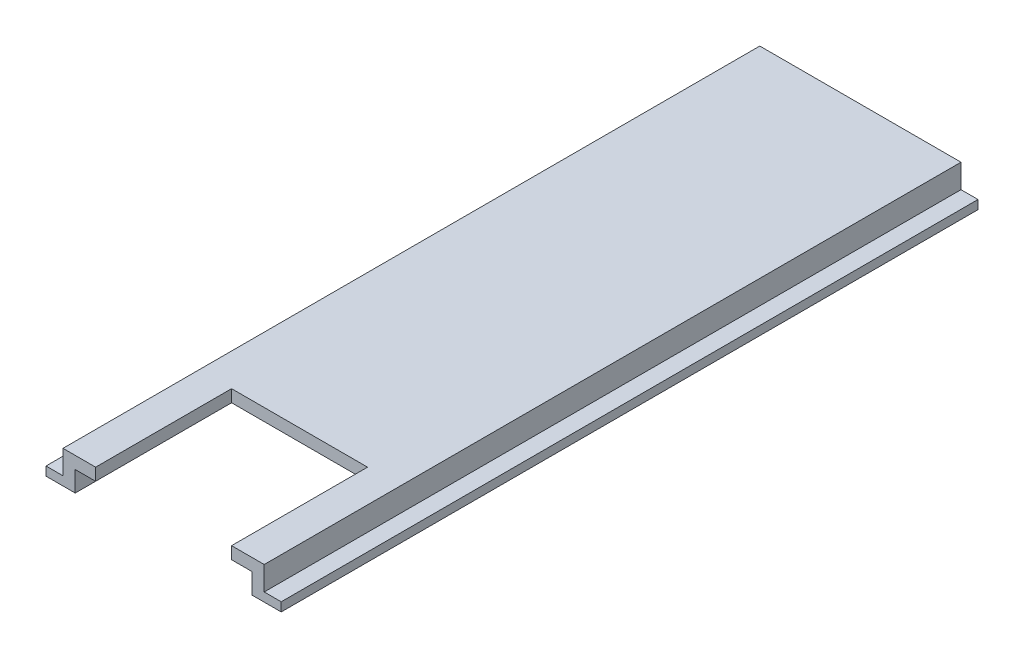
ISO-10303-21;
HEADER;
FILE_DESCRIPTION(('STEP AP214'),'2;1');
FILE_NAME('part.step','',(''),(''),'','','');
FILE_SCHEMA(('AUTOMOTIVE_DESIGN { 1 0 10303 214 1 1 1 1 }'));
ENDSEC;
DATA;
#1=APPLICATION_CONTEXT('core data for automotive mechanical design processes');
#2=APPLICATION_PROTOCOL_DEFINITION('international standard','automotive_design',2000,#1);
#3=PRODUCT_CONTEXT('',#1,'mechanical');
#4=PRODUCT('Part','Part','',(#3));
#5=PRODUCT_RELATED_PRODUCT_CATEGORY('part','',(#4));
#6=PRODUCT_DEFINITION_FORMATION('','',#4);
#7=PRODUCT_DEFINITION_CONTEXT('part definition',#1,'design');
#8=PRODUCT_DEFINITION('design','',#6,#7);
#9=PRODUCT_DEFINITION_SHAPE('','',#8);
#10=(LENGTH_UNIT() NAMED_UNIT(*) SI_UNIT(.MILLI.,.METRE.));
#11=(NAMED_UNIT(*) PLANE_ANGLE_UNIT() SI_UNIT($,.RADIAN.));
#12=(NAMED_UNIT(*) SI_UNIT($,.STERADIAN.) SOLID_ANGLE_UNIT());
#13=UNCERTAINTY_MEASURE_WITH_UNIT(LENGTH_MEASURE(1.E-05),#10,'distance_accuracy_value','');
#14=(GEOMETRIC_REPRESENTATION_CONTEXT(3) GLOBAL_UNCERTAINTY_ASSIGNED_CONTEXT((#13)) GLOBAL_UNIT_ASSIGNED_CONTEXT((#10,
#11,#12)) REPRESENTATION_CONTEXT('',''));
#15=CARTESIAN_POINT('',(0.,0.,0.));
#16=DIRECTION('',(0.,0.,1.));
#17=DIRECTION('',(1.,0.,0.));
#18=AXIS2_PLACEMENT_3D('',#15,#16,#17);
#19=CARTESIAN_POINT('',(0.,0.,56.5));
#20=DIRECTION('',(0.,0.,-1.));
#21=DIRECTION('',(-1.,0.,0.));
#22=AXIS2_PLACEMENT_3D('',#19,#20,#21);
#23=PLANE('',#22);
#24=DIRECTION('',(0.,1.,0.));
#25=VECTOR('',#24,1.);
#26=CARTESIAN_POINT('',(-9.,-0.00100000000000534,56.5));
#27=LINE('',#26,#25);
#28=CARTESIAN_POINT('',(-9.,2.99999999999999,56.5));
#29=VERTEX_POINT('',#28);
#30=CARTESIAN_POINT('',(-9.,4.79999999999999,56.5));
#31=VERTEX_POINT('',#30);
#32=EDGE_CURVE('E251',#29,#31,#27,.T.);
#33=ORIENTED_EDGE('',*,*,#32,.T.);
#34=DIRECTION('',(1.,0.,0.));
#35=VECTOR('',#34,1.);
#36=CARTESIAN_POINT('',(-13.8,4.79999999999999,56.5));
#37=LINE('',#36,#35);
#38=CARTESIAN_POINT('',(-13.8,4.79999999999999,56.5));
#39=VERTEX_POINT('',#38);
#40=EDGE_CURVE('E219',#39,#31,#37,.T.);
#41=ORIENTED_EDGE('',*,*,#40,.F.);
#42=DIRECTION('',(0.,1.,0.));
#43=VECTOR('',#42,1.);
#44=CARTESIAN_POINT('',(-13.8,1.29999999999999,56.5));
#45=LINE('',#44,#43);
#46=CARTESIAN_POINT('',(-13.8,1.29999999999999,56.5));
#47=VERTEX_POINT('',#46);
#48=EDGE_CURVE('E215',#47,#39,#45,.T.);
#49=ORIENTED_EDGE('',*,*,#48,.F.);
#50=DIRECTION('',(1.,0.,0.));
#51=VECTOR('',#50,1.);
#52=CARTESIAN_POINT('',(-16.3,1.29999999999999,56.5));
#53=LINE('',#52,#51);
#54=CARTESIAN_POINT('',(-16.3,1.29999999999999,56.5));
#55=VERTEX_POINT('',#54);
#56=EDGE_CURVE('E212',#55,#47,#53,.T.);
#57=ORIENTED_EDGE('',*,*,#56,.F.);
#58=DIRECTION('',(0.,1.,0.));
#59=VECTOR('',#58,1.);
#60=CARTESIAN_POINT('',(-16.3,0.,56.5));
#61=LINE('',#60,#59);
#62=CARTESIAN_POINT('',(-16.3,0.,56.5));
#63=VERTEX_POINT('',#62);
#64=EDGE_CURVE('E209',#63,#55,#61,.T.);
#65=ORIENTED_EDGE('',*,*,#64,.F.);
#66=DIRECTION('',(1.,0.,0.));
#67=VECTOR('',#66,1.);
#68=CARTESIAN_POINT('',(-12.,0.,56.5));
#69=LINE('',#68,#67);
#70=CARTESIAN_POINT('',(-12.,0.,56.5));
#71=VERTEX_POINT('',#70);
#72=EDGE_CURVE('E255',#63,#71,#69,.T.);
#73=ORIENTED_EDGE('',*,*,#72,.T.);
#74=DIRECTION('',(0.,1.,0.));
#75=VECTOR('',#74,1.);
#76=CARTESIAN_POINT('',(-12.,2.99999999999999,56.5));
#77=LINE('',#76,#75);
#78=CARTESIAN_POINT('',(-12.,2.99999999999999,56.5));
#79=VERTEX_POINT('',#78);
#80=EDGE_CURVE('E264',#71,#79,#77,.T.);
#81=ORIENTED_EDGE('',*,*,#80,.T.);
#82=DIRECTION('',(1.,0.,0.));
#83=VECTOR('',#82,1.);
#84=CARTESIAN_POINT('',(14.,3.,56.5));
#85=LINE('',#84,#83);
#86=EDGE_CURVE('E267',#79,#29,#85,.T.);
#87=ORIENTED_EDGE('',*,*,#86,.T.);
#88=EDGE_LOOP('',(#33,#41,#49,#57,#65,#73,#81,#87));
#89=FACE_BOUND('',#88,.T.);
#90=ADVANCED_FACE('F43',(#89),#23,.F.);
#91=CARTESIAN_POINT('',(-12.,0.,56.5));
#92=DIRECTION('',(0.,1.,0.));
#93=DIRECTION('',(-1.,0.,0.));
#94=AXIS2_PLACEMENT_3D('',#91,#92,#93);
#95=PLANE('',#94);
#96=ORIENTED_EDGE('',*,*,#72,.F.);
#97=DIRECTION('',(0.,0.,1.));
#98=VECTOR('',#97,1.);
#99=CARTESIAN_POINT('',(-16.3,0.,0.));
#100=LINE('',#99,#98);
#101=CARTESIAN_POINT('',(-16.3,0.,-46.));
#102=VERTEX_POINT('',#101);
#103=EDGE_CURVE('E227',#102,#63,#100,.T.);
#104=ORIENTED_EDGE('',*,*,#103,.F.);
#105=DIRECTION('',(-1.,0.,0.));
#106=VECTOR('',#105,1.);
#107=CARTESIAN_POINT('',(0.,0.,-46.));
#108=LINE('',#107,#106);
#109=CARTESIAN_POINT('',(-12.,0.,-46.));
#110=VERTEX_POINT('',#109);
#111=EDGE_CURVE('E194',#110,#102,#108,.T.);
#112=ORIENTED_EDGE('',*,*,#111,.F.);
#113=DIRECTION('',(0.,0.,-1.));
#114=VECTOR('',#113,1.);
#115=CARTESIAN_POINT('',(-12.,0.,56.5));
#116=LINE('',#115,#114);
#117=EDGE_CURVE('E51',#71,#110,#116,.T.);
#118=ORIENTED_EDGE('',*,*,#117,.F.);
#119=EDGE_LOOP('',(#96,#104,#112,#118));
#120=FACE_BOUND('',#119,.T.);
#121=ADVANCED_FACE('F45',(#120),#95,.F.);
#122=CARTESIAN_POINT('',(-12.,2.99999999999999,56.5));
#123=DIRECTION('',(-1.,0.,0.));
#124=DIRECTION('',(0.,-1.,0.));
#125=AXIS2_PLACEMENT_3D('',#122,#123,#124);
#126=PLANE('',#125);
#127=ORIENTED_EDGE('',*,*,#117,.T.);
#128=DIRECTION('',(0.,-1.,0.));
#129=VECTOR('',#128,1.);
#130=CARTESIAN_POINT('',(-12.,0.,-46.));
#131=LINE('',#130,#129);
#132=CARTESIAN_POINT('',(-12.,2.99999999999999,-46.));
#133=VERTEX_POINT('',#132);
#134=EDGE_CURVE('E191',#133,#110,#131,.T.);
#135=ORIENTED_EDGE('',*,*,#134,.F.);
#136=DIRECTION('',(0.,0.,-1.));
#137=VECTOR('',#136,1.);
#138=CARTESIAN_POINT('',(-12.,2.99999999999999,56.5));
#139=LINE('',#138,#137);
#140=EDGE_CURVE('E279',#79,#133,#139,.T.);
#141=ORIENTED_EDGE('',*,*,#140,.F.);
#142=ORIENTED_EDGE('',*,*,#80,.F.);
#143=EDGE_LOOP('',(#127,#135,#141,#142));
#144=FACE_BOUND('',#143,.T.);
#145=ADVANCED_FACE('F284',(#144),#126,.F.);
#146=CARTESIAN_POINT('',(14.,3.,56.5));
#147=DIRECTION('',(0.,1.,0.));
#148=DIRECTION('',(-1.,0.,0.));
#149=AXIS2_PLACEMENT_3D('',#146,#147,#148);
#150=PLANE('',#149);
#151=DIRECTION('',(1.,0.,0.));
#152=VECTOR('',#151,1.);
#153=CARTESIAN_POINT('',(-9.,2.99999999999999,36.5));
#154=LINE('',#153,#152);
#155=CARTESIAN_POINT('',(-9.,2.99999999999999,36.5));
#156=VERTEX_POINT('',#155);
#157=CARTESIAN_POINT('',(11.,2.99999999999999,36.5));
#158=VERTEX_POINT('',#157);
#159=EDGE_CURVE('E245',#156,#158,#154,.T.);
#160=ORIENTED_EDGE('',*,*,#159,.F.);
#161=DIRECTION('',(0.,0.,-1.));
#162=VECTOR('',#161,1.);
#163=CARTESIAN_POINT('',(-9.,2.99999999999999,36.5));
#164=LINE('',#163,#162);
#165=EDGE_CURVE('E248',#29,#156,#164,.T.);
#166=ORIENTED_EDGE('',*,*,#165,.F.);
#167=ORIENTED_EDGE('',*,*,#86,.F.);
#168=ORIENTED_EDGE('',*,*,#140,.T.);
#169=DIRECTION('',(-1.,0.,0.));
#170=VECTOR('',#169,1.);
#171=CARTESIAN_POINT('',(0.,2.99999999999999,-46.));
#172=LINE('',#171,#170);
#173=CARTESIAN_POINT('',(14.,3.,-46.));
#174=VERTEX_POINT('',#173);
#175=EDGE_CURVE('E188',#174,#133,#172,.T.);
#176=ORIENTED_EDGE('',*,*,#175,.F.);
#177=DIRECTION('',(0.,0.,-1.));
#178=VECTOR('',#177,1.);
#179=CARTESIAN_POINT('',(14.,3.,56.5));
#180=LINE('',#179,#178);
#181=CARTESIAN_POINT('',(14.,3.,56.5));
#182=VERTEX_POINT('',#181);
#183=EDGE_CURVE('E277',#182,#174,#180,.T.);
#184=ORIENTED_EDGE('',*,*,#183,.F.);
#185=CARTESIAN_POINT('',(11.,2.99999999999999,56.5));
#186=VERTEX_POINT('',#185);
#187=EDGE_CURVE('E266',#186,#182,#85,.T.);
#188=ORIENTED_EDGE('',*,*,#187,.F.);
#189=DIRECTION('',(0.,0.,1.));
#190=VECTOR('',#189,1.);
#191=CARTESIAN_POINT('',(11.,2.99999999999999,36.5));
#192=LINE('',#191,#190);
#193=EDGE_CURVE('E65',#158,#186,#192,.T.);
#194=ORIENTED_EDGE('',*,*,#193,.F.);
#195=EDGE_LOOP('',(#160,#166,#167,#168,#176,#184,#188,#194));
#196=FACE_BOUND('',#195,.T.);
#197=ADVANCED_FACE('F324',(#196),#150,.F.);
#198=CARTESIAN_POINT('',(14.,0.,56.5));
#199=DIRECTION('',(1.,0.,0.));
#200=DIRECTION('',(0.,0.,-1.));
#201=AXIS2_PLACEMENT_3D('',#198,#199,#200);
#202=PLANE('',#201);
#203=ORIENTED_EDGE('',*,*,#183,.T.);
#204=DIRECTION('',(0.,1.,0.));
#205=VECTOR('',#204,1.);
#206=CARTESIAN_POINT('',(14.,0.,-46.));
#207=LINE('',#206,#205);
#208=CARTESIAN_POINT('',(14.,0.,-46.));
#209=VERTEX_POINT('',#208);
#210=EDGE_CURVE('E185',#209,#174,#207,.T.);
#211=ORIENTED_EDGE('',*,*,#210,.F.);
#212=DIRECTION('',(0.,0.,-1.));
#213=VECTOR('',#212,1.);
#214=CARTESIAN_POINT('',(14.,0.,56.5));
#215=LINE('',#214,#213);
#216=CARTESIAN_POINT('',(14.,0.,56.5));
#217=VERTEX_POINT('',#216);
#218=EDGE_CURVE('E275',#217,#209,#215,.T.);
#219=ORIENTED_EDGE('',*,*,#218,.F.);
#220=DIRECTION('',(0.,-1.,0.));
#221=VECTOR('',#220,1.);
#222=CARTESIAN_POINT('',(14.,0.,56.5));
#223=LINE('',#222,#221);
#224=EDGE_CURVE('E270',#182,#217,#223,.T.);
#225=ORIENTED_EDGE('',*,*,#224,.F.);
#226=EDGE_LOOP('',(#203,#211,#219,#225));
#227=FACE_BOUND('',#226,.T.);
#228=ADVANCED_FACE('F318',(#227),#202,.F.);
#229=CARTESIAN_POINT('',(18.5,0.,56.5));
#230=DIRECTION('',(0.,1.,0.));
#231=DIRECTION('',(-1.,0.,0.));
#232=AXIS2_PLACEMENT_3D('',#229,#230,#231);
#233=PLANE('',#232);
#234=ORIENTED_EDGE('',*,*,#218,.T.);
#235=DIRECTION('',(-1.,0.,0.));
#236=VECTOR('',#235,1.);
#237=CARTESIAN_POINT('',(0.,0.,-46.));
#238=LINE('',#237,#236);
#239=CARTESIAN_POINT('',(18.3,0.,-46.));
#240=VERTEX_POINT('',#239);
#241=EDGE_CURVE('E175',#240,#209,#238,.T.);
#242=ORIENTED_EDGE('',*,*,#241,.F.);
#243=DIRECTION('',(0.,0.,1.));
#244=VECTOR('',#243,1.);
#245=CARTESIAN_POINT('',(18.3,0.,0.));
#246=LINE('',#245,#244);
#247=CARTESIAN_POINT('',(18.3,0.,56.5));
#248=VERTEX_POINT('',#247);
#249=EDGE_CURVE('E165',#240,#248,#246,.T.);
#250=ORIENTED_EDGE('',*,*,#249,.T.);
#251=DIRECTION('',(1.,0.,0.));
#252=VECTOR('',#251,1.);
#253=CARTESIAN_POINT('',(18.5,0.,56.5));
#254=LINE('',#253,#252);
#255=EDGE_CURVE('E272',#217,#248,#254,.T.);
#256=ORIENTED_EDGE('',*,*,#255,.F.);
#257=EDGE_LOOP('',(#234,#242,#250,#256));
#258=FACE_BOUND('',#257,.T.);
#259=ADVANCED_FACE('F314',(#258),#233,.F.);
#260=ORIENTED_EDGE('',*,*,#255,.T.);
#261=DIRECTION('',(0.,-1.,0.));
#262=VECTOR('',#261,1.);
#263=CARTESIAN_POINT('',(18.3,1.3,56.5));
#264=LINE('',#263,#262);
#265=CARTESIAN_POINT('',(18.3,1.3,56.5));
#266=VERTEX_POINT('',#265);
#267=EDGE_CURVE('E225',#266,#248,#264,.T.);
#268=ORIENTED_EDGE('',*,*,#267,.F.);
#269=DIRECTION('',(1.,0.,0.));
#270=VECTOR('',#269,1.);
#271=CARTESIAN_POINT('',(15.8,1.3,56.5));
#272=LINE('',#271,#270);
#273=CARTESIAN_POINT('',(15.8,1.3,56.5));
#274=VERTEX_POINT('',#273);
#275=EDGE_CURVE('E162',#274,#266,#272,.T.);
#276=ORIENTED_EDGE('',*,*,#275,.F.);
#277=DIRECTION('',(0.,-1.,0.));
#278=VECTOR('',#277,1.);
#279=CARTESIAN_POINT('',(15.8,4.79999999999999,56.5));
#280=LINE('',#279,#278);
#281=CARTESIAN_POINT('',(15.8,4.79999999999999,56.5));
#282=VERTEX_POINT('',#281);
#283=EDGE_CURVE('E221',#282,#274,#280,.T.);
#284=ORIENTED_EDGE('',*,*,#283,.F.);
#285=CARTESIAN_POINT('',(11.,4.79999999999999,56.5));
#286=VERTEX_POINT('',#285);
#287=EDGE_CURVE('E218',#286,#282,#37,.T.);
#288=ORIENTED_EDGE('',*,*,#287,.F.);
#289=DIRECTION('',(0.,1.,0.));
#290=VECTOR('',#289,1.);
#291=CARTESIAN_POINT('',(11.,-0.00100000000000534,56.5));
#292=LINE('',#291,#290);
#293=EDGE_CURVE('E259',#186,#286,#292,.T.);
#294=ORIENTED_EDGE('',*,*,#293,.F.);
#295=ORIENTED_EDGE('',*,*,#187,.T.);
#296=ORIENTED_EDGE('',*,*,#224,.T.);
#297=EDGE_LOOP('',(#260,#268,#276,#284,#288,#294,#295,#296));
#298=FACE_BOUND('',#297,.T.);
#299=ADVANCED_FACE('F311',(#298),#23,.F.);
#300=CARTESIAN_POINT('',(-9.,-0.00100000000000534,36.5));
#301=DIRECTION('',(-1.,0.,0.));
#302=DIRECTION('',(0.,0.,1.));
#303=AXIS2_PLACEMENT_3D('',#300,#301,#302);
#304=PLANE('',#303);
#305=DIRECTION('',(0.,1.,0.));
#306=VECTOR('',#305,1.);
#307=CARTESIAN_POINT('',(-9.,-0.00100000000000534,36.5));
#308=LINE('',#307,#306);
#309=CARTESIAN_POINT('',(-9.,4.79999999999999,36.5));
#310=VERTEX_POINT('',#309);
#311=EDGE_CURVE('E252',#156,#310,#308,.T.);
#312=ORIENTED_EDGE('',*,*,#311,.T.);
#313=DIRECTION('',(0.,0.,1.));
#314=VECTOR('',#313,1.);
#315=CARTESIAN_POINT('',(-9.,4.79999999999999,36.5));
#316=LINE('',#315,#314);
#317=EDGE_CURVE('E241',#310,#31,#316,.T.);
#318=ORIENTED_EDGE('',*,*,#317,.T.);
#319=ORIENTED_EDGE('',*,*,#32,.F.);
#320=ORIENTED_EDGE('',*,*,#165,.T.);
#321=EDGE_LOOP('',(#312,#318,#319,#320));
#322=FACE_BOUND('',#321,.T.);
#323=ADVANCED_FACE('F328',(#322),#304,.F.);
#324=CARTESIAN_POINT('',(-9.,-0.00100000000000534,36.5));
#325=DIRECTION('',(0.,0.,-1.));
#326=DIRECTION('',(-1.,0.,0.));
#327=AXIS2_PLACEMENT_3D('',#324,#325,#326);
#328=PLANE('',#327);
#329=DIRECTION('',(0.,1.,0.));
#330=VECTOR('',#329,1.);
#331=CARTESIAN_POINT('',(11.,-0.00100000000000534,36.5));
#332=LINE('',#331,#330);
#333=CARTESIAN_POINT('',(11.,4.79999999999999,36.5));
#334=VERTEX_POINT('',#333);
#335=EDGE_CURVE('E256',#158,#334,#332,.T.);
#336=ORIENTED_EDGE('',*,*,#335,.T.);
#337=DIRECTION('',(-1.,0.,0.));
#338=VECTOR('',#337,1.);
#339=CARTESIAN_POINT('',(-9.,4.79999999999999,36.5));
#340=LINE('',#339,#338);
#341=EDGE_CURVE('E58',#334,#310,#340,.T.);
#342=ORIENTED_EDGE('',*,*,#341,.T.);
#343=ORIENTED_EDGE('',*,*,#311,.F.);
#344=ORIENTED_EDGE('',*,*,#159,.T.);
#345=EDGE_LOOP('',(#336,#342,#343,#344));
#346=FACE_BOUND('',#345,.T.);
#347=ADVANCED_FACE('F330',(#346),#328,.F.);
#348=CARTESIAN_POINT('',(11.,-0.00100000000000534,36.5));
#349=DIRECTION('',(1.,0.,0.));
#350=DIRECTION('',(0.,0.,-1.));
#351=AXIS2_PLACEMENT_3D('',#348,#349,#350);
#352=PLANE('',#351);
#353=ORIENTED_EDGE('',*,*,#293,.T.);
#354=DIRECTION('',(0.,0.,-1.));
#355=VECTOR('',#354,1.);
#356=CARTESIAN_POINT('',(11.,4.79999999999999,36.5));
#357=LINE('',#356,#355);
#358=EDGE_CURVE('E11',#286,#334,#357,.T.);
#359=ORIENTED_EDGE('',*,*,#358,.T.);
#360=ORIENTED_EDGE('',*,*,#335,.F.);
#361=ORIENTED_EDGE('',*,*,#193,.T.);
#362=EDGE_LOOP('',(#353,#359,#360,#361));
#363=FACE_BOUND('',#362,.T.);
#364=ADVANCED_FACE('F331',(#363),#352,.F.);
#365=CARTESIAN_POINT('',(-13.8,4.79999999999999,0.));
#366=DIRECTION('',(0.,-1.,0.));
#367=DIRECTION('',(0.,0.,-1.));
#368=AXIS2_PLACEMENT_3D('',#365,#366,#367);
#369=PLANE('',#368);
#370=ORIENTED_EDGE('',*,*,#341,.F.);
#371=ORIENTED_EDGE('',*,*,#358,.F.);
#372=ORIENTED_EDGE('',*,*,#287,.T.);
#373=DIRECTION('',(0.,0.,1.));
#374=VECTOR('',#373,1.);
#375=CARTESIAN_POINT('',(15.8,4.79999999999999,0.));
#376=LINE('',#375,#374);
#377=CARTESIAN_POINT('',(15.8,4.79999999999999,-46.));
#378=VERTEX_POINT('',#377);
#379=EDGE_CURVE('E230',#378,#282,#376,.T.);
#380=ORIENTED_EDGE('',*,*,#379,.F.);
#381=DIRECTION('',(1.,0.,0.));
#382=VECTOR('',#381,1.);
#383=CARTESIAN_POINT('',(0.,4.79999999999999,-46.));
#384=LINE('',#383,#382);
#385=CARTESIAN_POINT('',(-13.8,4.79999999999999,-46.));
#386=VERTEX_POINT('',#385);
#387=EDGE_CURVE('E206',#386,#378,#384,.T.);
#388=ORIENTED_EDGE('',*,*,#387,.F.);
#389=DIRECTION('',(0.,0.,1.));
#390=VECTOR('',#389,1.);
#391=CARTESIAN_POINT('',(-13.8,4.79999999999999,0.));
#392=LINE('',#391,#390);
#393=EDGE_CURVE('E233',#386,#39,#392,.T.);
#394=ORIENTED_EDGE('',*,*,#393,.T.);
#395=ORIENTED_EDGE('',*,*,#40,.T.);
#396=ORIENTED_EDGE('',*,*,#317,.F.);
#397=EDGE_LOOP('',(#370,#371,#372,#380,#388,#394,#395,#396));
#398=FACE_BOUND('',#397,.T.);
#399=ADVANCED_FACE('F305',(#398),#369,.F.);
#400=CARTESIAN_POINT('',(18.3,1.3,0.));
#401=DIRECTION('',(-1.,0.,0.));
#402=DIRECTION('',(0.,0.,1.));
#403=AXIS2_PLACEMENT_3D('',#400,#401,#402);
#404=PLANE('',#403);
#405=ORIENTED_EDGE('',*,*,#267,.T.);
#406=ORIENTED_EDGE('',*,*,#249,.F.);
#407=DIRECTION('',(0.,-1.,0.));
#408=VECTOR('',#407,1.);
#409=CARTESIAN_POINT('',(18.3,0.,-46.));
#410=LINE('',#409,#408);
#411=CARTESIAN_POINT('',(18.3,1.3,-46.));
#412=VERTEX_POINT('',#411);
#413=EDGE_CURVE('E169',#412,#240,#410,.T.);
#414=ORIENTED_EDGE('',*,*,#413,.F.);
#415=DIRECTION('',(0.,0.,1.));
#416=VECTOR('',#415,1.);
#417=CARTESIAN_POINT('',(18.3,1.3,0.));
#418=LINE('',#417,#416);
#419=EDGE_CURVE('E156',#412,#266,#418,.T.);
#420=ORIENTED_EDGE('',*,*,#419,.T.);
#421=EDGE_LOOP('',(#405,#406,#414,#420));
#422=FACE_BOUND('',#421,.T.);
#423=ADVANCED_FACE('F170',(#422),#404,.F.);
#424=CARTESIAN_POINT('',(15.8,1.3,0.));
#425=DIRECTION('',(0.,-1.,0.));
#426=DIRECTION('',(0.,0.,-1.));
#427=AXIS2_PLACEMENT_3D('',#424,#425,#426);
#428=PLANE('',#427);
#429=ORIENTED_EDGE('',*,*,#275,.T.);
#430=ORIENTED_EDGE('',*,*,#419,.F.);
#431=DIRECTION('',(1.,0.,0.));
#432=VECTOR('',#431,1.);
#433=CARTESIAN_POINT('',(0.,1.3,-46.));
#434=LINE('',#433,#432);
#435=CARTESIAN_POINT('',(15.8,1.3,-46.));
#436=VERTEX_POINT('',#435);
#437=EDGE_CURVE('E160',#436,#412,#434,.T.);
#438=ORIENTED_EDGE('',*,*,#437,.F.);
#439=DIRECTION('',(0.,0.,1.));
#440=VECTOR('',#439,1.);
#441=CARTESIAN_POINT('',(15.8,1.3,0.));
#442=LINE('',#441,#440);
#443=EDGE_CURVE('E166',#436,#274,#442,.T.);
#444=ORIENTED_EDGE('',*,*,#443,.T.);
#445=EDGE_LOOP('',(#429,#430,#438,#444));
#446=FACE_BOUND('',#445,.T.);
#447=ADVANCED_FACE('F158',(#446),#428,.F.);
#448=CARTESIAN_POINT('',(15.8,4.79999999999999,0.));
#449=DIRECTION('',(-1.,0.,0.));
#450=DIRECTION('',(0.,0.,1.));
#451=AXIS2_PLACEMENT_3D('',#448,#449,#450);
#452=PLANE('',#451);
#453=ORIENTED_EDGE('',*,*,#283,.T.);
#454=ORIENTED_EDGE('',*,*,#443,.F.);
#455=DIRECTION('',(0.,-1.,0.));
#456=VECTOR('',#455,1.);
#457=CARTESIAN_POINT('',(15.8,0.,-46.));
#458=LINE('',#457,#456);
#459=EDGE_CURVE('E181',#378,#436,#458,.T.);
#460=ORIENTED_EDGE('',*,*,#459,.F.);
#461=ORIENTED_EDGE('',*,*,#379,.T.);
#462=EDGE_LOOP('',(#453,#454,#460,#461));
#463=FACE_BOUND('',#462,.T.);
#464=ADVANCED_FACE('F307',(#463),#452,.F.);
#465=CARTESIAN_POINT('',(-13.8,1.29999999999999,0.));
#466=DIRECTION('',(1.,0.,0.));
#467=DIRECTION('',(0.,0.,-1.));
#468=AXIS2_PLACEMENT_3D('',#465,#466,#467);
#469=PLANE('',#468);
#470=ORIENTED_EDGE('',*,*,#48,.T.);
#471=ORIENTED_EDGE('',*,*,#393,.F.);
#472=DIRECTION('',(0.,1.,0.));
#473=VECTOR('',#472,1.);
#474=CARTESIAN_POINT('',(-13.8,0.,-46.));
#475=LINE('',#474,#473);
#476=CARTESIAN_POINT('',(-13.8,1.29999999999999,-46.));
#477=VERTEX_POINT('',#476);
#478=EDGE_CURVE('E203',#477,#386,#475,.T.);
#479=ORIENTED_EDGE('',*,*,#478,.F.);
#480=DIRECTION('',(0.,0.,1.));
#481=VECTOR('',#480,1.);
#482=CARTESIAN_POINT('',(-13.8,1.29999999999999,0.));
#483=LINE('',#482,#481);
#484=EDGE_CURVE('E235',#477,#47,#483,.T.);
#485=ORIENTED_EDGE('',*,*,#484,.T.);
#486=EDGE_LOOP('',(#470,#471,#479,#485));
#487=FACE_BOUND('',#486,.T.);
#488=ADVANCED_FACE('F304',(#487),#469,.F.);
#489=CARTESIAN_POINT('',(-16.3,1.29999999999999,0.));
#490=DIRECTION('',(0.,-1.,0.));
#491=DIRECTION('',(0.,0.,-1.));
#492=AXIS2_PLACEMENT_3D('',#489,#490,#491);
#493=PLANE('',#492);
#494=ORIENTED_EDGE('',*,*,#56,.T.);
#495=ORIENTED_EDGE('',*,*,#484,.F.);
#496=DIRECTION('',(1.,0.,0.));
#497=VECTOR('',#496,1.);
#498=CARTESIAN_POINT('',(0.,1.29999999999999,-46.));
#499=LINE('',#498,#497);
#500=CARTESIAN_POINT('',(-16.3,1.29999999999999,-46.));
#501=VERTEX_POINT('',#500);
#502=EDGE_CURVE('E200',#501,#477,#499,.T.);
#503=ORIENTED_EDGE('',*,*,#502,.F.);
#504=DIRECTION('',(0.,0.,1.));
#505=VECTOR('',#504,1.);
#506=CARTESIAN_POINT('',(-16.3,1.29999999999999,0.));
#507=LINE('',#506,#505);
#508=EDGE_CURVE('E237',#501,#55,#507,.T.);
#509=ORIENTED_EDGE('',*,*,#508,.T.);
#510=EDGE_LOOP('',(#494,#495,#503,#509));
#511=FACE_BOUND('',#510,.T.);
#512=ADVANCED_FACE('F299',(#511),#493,.F.);
#513=CARTESIAN_POINT('',(-16.3,0.,0.));
#514=DIRECTION('',(1.,0.,0.));
#515=DIRECTION('',(0.,0.,-1.));
#516=AXIS2_PLACEMENT_3D('',#513,#514,#515);
#517=PLANE('',#516);
#518=ORIENTED_EDGE('',*,*,#64,.T.);
#519=ORIENTED_EDGE('',*,*,#508,.F.);
#520=DIRECTION('',(0.,1.,0.));
#521=VECTOR('',#520,1.);
#522=CARTESIAN_POINT('',(-16.3,0.,-46.));
#523=LINE('',#522,#521);
#524=EDGE_CURVE('E197',#102,#501,#523,.T.);
#525=ORIENTED_EDGE('',*,*,#524,.F.);
#526=ORIENTED_EDGE('',*,*,#103,.T.);
#527=EDGE_LOOP('',(#518,#519,#525,#526));
#528=FACE_BOUND('',#527,.T.);
#529=ADVANCED_FACE('F293',(#528),#517,.F.);
#530=CARTESIAN_POINT('',(0.,0.,-46.));
#531=DIRECTION('',(0.,0.,-1.));
#532=DIRECTION('',(-1.,0.,0.));
#533=AXIS2_PLACEMENT_3D('',#530,#531,#532);
#534=PLANE('',#533);
#535=ORIENTED_EDGE('',*,*,#437,.T.);
#536=ORIENTED_EDGE('',*,*,#413,.T.);
#537=ORIENTED_EDGE('',*,*,#241,.T.);
#538=ORIENTED_EDGE('',*,*,#210,.T.);
#539=ORIENTED_EDGE('',*,*,#175,.T.);
#540=ORIENTED_EDGE('',*,*,#134,.T.);
#541=ORIENTED_EDGE('',*,*,#111,.T.);
#542=ORIENTED_EDGE('',*,*,#524,.T.);
#543=ORIENTED_EDGE('',*,*,#502,.T.);
#544=ORIENTED_EDGE('',*,*,#478,.T.);
#545=ORIENTED_EDGE('',*,*,#387,.T.);
#546=ORIENTED_EDGE('',*,*,#459,.T.);
#547=EDGE_LOOP('',(#535,#536,#537,#538,#539,#540,#541,#542,#543,#544,#545,#546));
#548=FACE_BOUND('',#547,.T.);
#549=ADVANCED_FACE('F178',(#548),#534,.T.);
#550=CLOSED_SHELL('',(#90,#121,#145,#197,#228,#259,#299,#323,#347,#364,#399,#423,#447,#464,#488,
#512,#529,#549));
#551=MANIFOLD_SOLID_BREP('B2',#550);
#552=ADVANCED_BREP_SHAPE_REPRESENTATION('',(#18,#551),#14);
#553=SHAPE_DEFINITION_REPRESENTATION(#9,#552);
ENDSEC;
END-ISO-10303-21;
